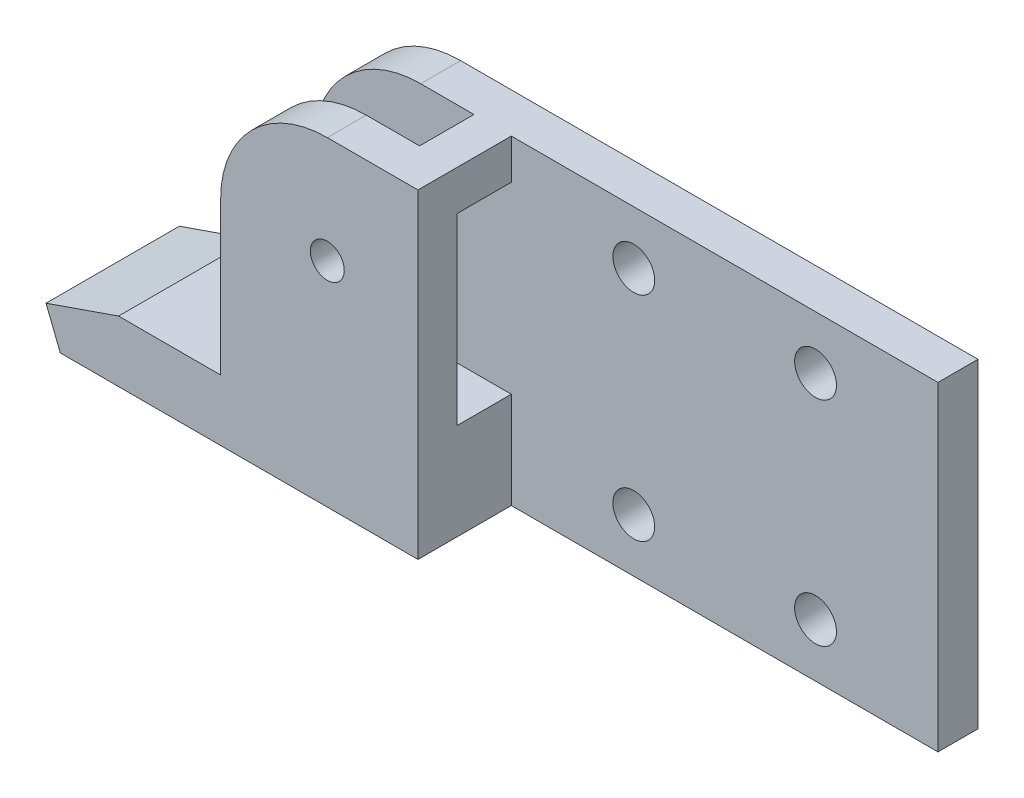
ISO-10303-21;
HEADER;
FILE_DESCRIPTION(('STEP AP214'),'2;1');
FILE_NAME('part.step','',(''),(''),'','','');
FILE_SCHEMA(('AUTOMOTIVE_DESIGN { 1 0 10303 214 1 1 1 1 }'));
ENDSEC;
DATA;
#1=APPLICATION_CONTEXT('core data for automotive mechanical design processes');
#2=APPLICATION_PROTOCOL_DEFINITION('international standard','automotive_design',2000,#1);
#3=PRODUCT_CONTEXT('',#1,'mechanical');
#4=PRODUCT('Part','Part','',(#3));
#5=PRODUCT_RELATED_PRODUCT_CATEGORY('part','',(#4));
#6=PRODUCT_DEFINITION_FORMATION('','',#4);
#7=PRODUCT_DEFINITION_CONTEXT('part definition',#1,'design');
#8=PRODUCT_DEFINITION('design','',#6,#7);
#9=PRODUCT_DEFINITION_SHAPE('','',#8);
#10=(LENGTH_UNIT() NAMED_UNIT(*) SI_UNIT(.MILLI.,.METRE.));
#11=(NAMED_UNIT(*) PLANE_ANGLE_UNIT() SI_UNIT($,.RADIAN.));
#12=(NAMED_UNIT(*) SI_UNIT($,.STERADIAN.) SOLID_ANGLE_UNIT());
#13=UNCERTAINTY_MEASURE_WITH_UNIT(LENGTH_MEASURE(1.E-05),#10,'distance_accuracy_value','');
#14=(GEOMETRIC_REPRESENTATION_CONTEXT(3) GLOBAL_UNCERTAINTY_ASSIGNED_CONTEXT((#13)) GLOBAL_UNIT_ASSIGNED_CONTEXT((#10,
#11,#12)) REPRESENTATION_CONTEXT('',''));
#15=CARTESIAN_POINT('',(0.,0.,0.));
#16=DIRECTION('',(0.,0.,1.));
#17=DIRECTION('',(1.,0.,0.));
#18=AXIS2_PLACEMENT_3D('',#15,#16,#17);
#19=CARTESIAN_POINT('',(-36.195000000001,-203.1333598559,4.7625));
#20=DIRECTION('',(0.,0.,-1.));
#21=DIRECTION('',(-1.,0.,0.));
#22=AXIS2_PLACEMENT_3D('',#19,#20,#21);
#23=CYLINDRICAL_SURFACE('',#22,12.7);
#24=DIRECTION('',(0.,0.,-1.));
#25=VECTOR('',#24,1.);
#26=CARTESIAN_POINT('',(-36.195000000001,-190.4333598559,4.7625));
#27=LINE('',#26,#25);
#28=CARTESIAN_POINT('',(-36.195000000001,-190.4333598559,15.875));
#29=VERTEX_POINT('',#28);
#30=CARTESIAN_POINT('',(-36.195000000001,-190.4333598559,11.2395));
#31=VERTEX_POINT('',#30);
#32=EDGE_CURVE('E276',#29,#31,#27,.T.);
#33=ORIENTED_EDGE('',*,*,#32,.T.);
#34=CARTESIAN_POINT('',(-36.195000000001,-203.1333598559,11.2395));
#35=DIRECTION('',(0.,0.,-1.));
#36=DIRECTION('',(0.,1.,0.));
#37=AXIS2_PLACEMENT_3D('',#34,#35,#36);
#38=CIRCLE('',#37,12.7);
#39=CARTESIAN_POINT('',(-48.895000000001,-203.1333598559,11.2395));
#40=VERTEX_POINT('',#39);
#41=EDGE_CURVE('E202',#40,#31,#38,.T.);
#42=ORIENTED_EDGE('',*,*,#41,.F.);
#43=DIRECTION('',(0.,0.,-1.));
#44=VECTOR('',#43,1.);
#45=CARTESIAN_POINT('',(-48.895000000001,-203.1333598559,4.7625));
#46=LINE('',#45,#44);
#47=CARTESIAN_POINT('',(-48.895000000001,-203.1333598559,15.875));
#48=VERTEX_POINT('',#47);
#49=EDGE_CURVE('E273',#48,#40,#46,.T.);
#50=ORIENTED_EDGE('',*,*,#49,.F.);
#51=CARTESIAN_POINT('',(-36.195000000001,-203.1333598559,15.875));
#52=DIRECTION('',(0.,0.,-1.));
#53=DIRECTION('',(-1.,0.,0.));
#54=AXIS2_PLACEMENT_3D('',#51,#52,#53);
#55=CIRCLE('',#54,12.7);
#56=EDGE_CURVE('E227',#48,#29,#55,.T.);
#57=ORIENTED_EDGE('',*,*,#56,.T.);
#58=EDGE_LOOP('',(#33,#42,#50,#57));
#59=FACE_BOUND('',#58,.T.);
#60=ADVANCED_FACE('F38',(#59),#23,.T.);
#61=CARTESIAN_POINT('',(-36.195000000001,-203.1333598559,4.7625));
#62=DIRECTION('',(0.,0.,1.));
#63=DIRECTION('',(1.,0.,0.));
#64=AXIS2_PLACEMENT_3D('',#61,#62,#63);
#65=CIRCLE('',#64,12.7);
#66=CARTESIAN_POINT('',(-36.195000000001,-190.4333598559,4.7625));
#67=VERTEX_POINT('',#66);
#68=CARTESIAN_POINT('',(-48.895000000001,-203.1333598559,4.7625));
#69=VERTEX_POINT('',#68);
#70=EDGE_CURVE('E61',#67,#69,#65,.T.);
#71=ORIENTED_EDGE('',*,*,#70,.F.);
#72=CARTESIAN_POINT('',(-36.195000000001,-190.4333598559,0.));
#73=VERTEX_POINT('',#72);
#74=EDGE_CURVE('E178',#67,#73,#27,.T.);
#75=ORIENTED_EDGE('',*,*,#74,.T.);
#76=CARTESIAN_POINT('',(-36.195000000001,-203.1333598559,0.));
#77=DIRECTION('',(0.,0.,1.));
#78=DIRECTION('',(1.,0.,0.));
#79=AXIS2_PLACEMENT_3D('',#76,#77,#78);
#80=CIRCLE('',#79,12.7);
#81=CARTESIAN_POINT('',(-48.895000000001,-203.1333598559,0.));
#82=VERTEX_POINT('',#81);
#83=EDGE_CURVE('E261',#73,#82,#80,.T.);
#84=ORIENTED_EDGE('',*,*,#83,.T.);
#85=EDGE_CURVE('E272',#69,#82,#46,.T.);
#86=ORIENTED_EDGE('',*,*,#85,.F.);
#87=EDGE_LOOP('',(#71,#75,#84,#86));
#88=FACE_BOUND('',#87,.T.);
#89=ADVANCED_FACE('F336',(#88),#23,.T.);
#90=CARTESIAN_POINT('',(-36.195000000001,-190.4333598559,4.7625));
#91=DIRECTION('',(0.,-1.,0.));
#92=DIRECTION('',(0.,0.,-1.));
#93=AXIS2_PLACEMENT_3D('',#90,#91,#92);
#94=PLANE('',#93);
#95=DIRECTION('',(-1.,0.,0.));
#96=VECTOR('',#95,1.);
#97=CARTESIAN_POINT('',(-29.845000000001,-190.4333598559,11.2395));
#98=LINE('',#97,#96);
#99=CARTESIAN_POINT('',(-29.845000000001,-190.4333598559,11.2395));
#100=VERTEX_POINT('',#99);
#101=EDGE_CURVE('E179',#100,#31,#98,.T.);
#102=ORIENTED_EDGE('',*,*,#101,.T.);
#103=ORIENTED_EDGE('',*,*,#32,.F.);
#104=DIRECTION('',(1.,0.,0.));
#105=VECTOR('',#104,1.);
#106=CARTESIAN_POINT('',(-36.195000000001,-190.4333598559,15.875));
#107=LINE('',#106,#105);
#108=CARTESIAN_POINT('',(-25.4000000000009,-190.4333598559,15.875));
#109=VERTEX_POINT('',#108);
#110=EDGE_CURVE('E205',#29,#109,#107,.T.);
#111=ORIENTED_EDGE('',*,*,#110,.T.);
#112=DIRECTION('',(0.,0.,-1.));
#113=VECTOR('',#112,1.);
#114=CARTESIAN_POINT('',(-25.4000000000009,-190.4333598559,15.875));
#115=LINE('',#114,#113);
#116=CARTESIAN_POINT('',(-25.4000000000009,-190.4333598559,4.7625));
#117=VERTEX_POINT('',#116);
#118=EDGE_CURVE('E230',#109,#117,#115,.T.);
#119=ORIENTED_EDGE('',*,*,#118,.T.);
#120=DIRECTION('',(-1.,0.,0.));
#121=VECTOR('',#120,1.);
#122=CARTESIAN_POINT('',(-36.195000000001,-190.4333598559,4.7625));
#123=LINE('',#122,#121);
#124=CARTESIAN_POINT('',(25.3999999999991,-190.4333598559,4.7625));
#125=VERTEX_POINT('',#124);
#126=EDGE_CURVE('E247',#125,#117,#123,.T.);
#127=ORIENTED_EDGE('',*,*,#126,.F.);
#128=DIRECTION('',(0.,0.,-1.));
#129=VECTOR('',#128,1.);
#130=CARTESIAN_POINT('',(25.3999999999991,-190.4333598559,4.7625));
#131=LINE('',#130,#129);
#132=CARTESIAN_POINT('',(25.3999999999991,-190.4333598559,0.));
#133=VERTEX_POINT('',#132);
#134=EDGE_CURVE('E279',#125,#133,#131,.T.);
#135=ORIENTED_EDGE('',*,*,#134,.T.);
#136=DIRECTION('',(-1.,0.,0.));
#137=VECTOR('',#136,1.);
#138=CARTESIAN_POINT('',(-36.195000000001,-190.4333598559,0.));
#139=LINE('',#138,#137);
#140=EDGE_CURVE('E259',#133,#73,#139,.T.);
#141=ORIENTED_EDGE('',*,*,#140,.T.);
#142=ORIENTED_EDGE('',*,*,#74,.F.);
#143=DIRECTION('',(-1.,0.,0.));
#144=VECTOR('',#143,1.);
#145=CARTESIAN_POINT('',(-29.845000000001,-190.4333598559,4.7625));
#146=LINE('',#145,#144);
#147=CARTESIAN_POINT('',(-29.845000000001,-190.4333598559,4.7625));
#148=VERTEX_POINT('',#147);
#149=EDGE_CURVE('E161',#148,#67,#146,.T.);
#150=ORIENTED_EDGE('',*,*,#149,.F.);
#151=DIRECTION('',(0.,0.,1.));
#152=VECTOR('',#151,1.);
#153=CARTESIAN_POINT('',(-29.845000000001,-190.4333598559,0.));
#154=LINE('',#153,#152);
#155=EDGE_CURVE('E166',#148,#100,#154,.T.);
#156=ORIENTED_EDGE('',*,*,#155,.T.);
#157=EDGE_LOOP('',(#102,#103,#111,#119,#127,#135,#141,#142,#150,#156));
#158=FACE_BOUND('',#157,.T.);
#159=ADVANCED_FACE('F176',(#158),#94,.F.);
#160=CARTESIAN_POINT('',(-24.765000000001,-195.1958598559,0.));
#161=DIRECTION('',(0.,-1.,0.));
#162=DIRECTION('',(1.,0.,0.));
#163=AXIS2_PLACEMENT_3D('',#160,#161,#162);
#164=PLANE('',#163);
#165=DIRECTION('',(-1.,0.,0.));
#166=VECTOR('',#165,1.);
#167=CARTESIAN_POINT('',(-24.765000000001,-195.1958598559,11.2395));
#168=LINE('',#167,#166);
#169=CARTESIAN_POINT('',(-25.4000000000009,-195.1958598559,11.2395));
#170=VERTEX_POINT('',#169);
#171=CARTESIAN_POINT('',(-29.845000000001,-195.1958598559,11.2395));
#172=VERTEX_POINT('',#171);
#173=EDGE_CURVE('E192',#170,#172,#168,.T.);
#174=ORIENTED_EDGE('',*,*,#173,.T.);
#175=DIRECTION('',(0.,0.,1.));
#176=VECTOR('',#175,1.);
#177=CARTESIAN_POINT('',(-29.845000000001,-195.1958598559,0.));
#178=LINE('',#177,#176);
#179=CARTESIAN_POINT('',(-29.845000000001,-195.1958598559,4.7625));
#180=VERTEX_POINT('',#179);
#181=EDGE_CURVE('E165',#180,#172,#178,.T.);
#182=ORIENTED_EDGE('',*,*,#181,.F.);
#183=DIRECTION('',(-1.,0.,0.));
#184=VECTOR('',#183,1.);
#185=CARTESIAN_POINT('',(-24.765000000001,-195.1958598559,4.7625));
#186=LINE('',#185,#184);
#187=CARTESIAN_POINT('',(-25.4000000000009,-195.1958598559,4.7625));
#188=VERTEX_POINT('',#187);
#189=EDGE_CURVE('E164',#188,#180,#186,.T.);
#190=ORIENTED_EDGE('',*,*,#189,.F.);
#191=DIRECTION('',(0.,0.,-1.));
#192=VECTOR('',#191,1.);
#193=CARTESIAN_POINT('',(-25.4000000000009,-195.1958598559,15.875));
#194=LINE('',#193,#192);
#195=EDGE_CURVE('E291',#170,#188,#194,.T.);
#196=ORIENTED_EDGE('',*,*,#195,.F.);
#197=EDGE_LOOP('',(#174,#182,#190,#196));
#198=FACE_BOUND('',#197,.T.);
#199=ADVANCED_FACE('F362',(#198),#164,.T.);
#200=CARTESIAN_POINT('',(-48.895000000001,-221.260552334303,4.7625));
#201=DIRECTION('',(1.,0.,0.));
#202=DIRECTION('',(0.,1.,0.));
#203=AXIS2_PLACEMENT_3D('',#200,#201,#202);
#204=PLANE('',#203);
#205=DIRECTION('',(0.,-1.,0.));
#206=VECTOR('',#205,1.);
#207=CARTESIAN_POINT('',(-48.895000000001,0.,11.2395));
#208=LINE('',#207,#206);
#209=CARTESIAN_POINT('',(-48.895000000001,-217.052510473162,11.2395));
#210=VERTEX_POINT('',#209);
#211=EDGE_CURVE('E181',#40,#210,#208,.T.);
#212=ORIENTED_EDGE('',*,*,#211,.T.);
#213=DIRECTION('',(0.,0.,-1.));
#214=VECTOR('',#213,1.);
#215=CARTESIAN_POINT('',(-48.895000000001,-217.052510473162,0.));
#216=LINE('',#215,#214);
#217=CARTESIAN_POINT('',(-48.895000000001,-217.052510473162,4.7625));
#218=VERTEX_POINT('',#217);
#219=EDGE_CURVE('E189',#210,#218,#216,.T.);
#220=ORIENTED_EDGE('',*,*,#219,.T.);
#221=DIRECTION('',(0.,1.,0.));
#222=VECTOR('',#221,1.);
#223=CARTESIAN_POINT('',(-48.895000000001,0.,4.7625));
#224=LINE('',#223,#222);
#225=EDGE_CURVE('E187',#218,#69,#224,.T.);
#226=ORIENTED_EDGE('',*,*,#225,.T.);
#227=ORIENTED_EDGE('',*,*,#85,.T.);
#228=DIRECTION('',(0.,-1.,0.));
#229=VECTOR('',#228,1.);
#230=CARTESIAN_POINT('',(-48.895000000001,-221.260552334303,0.));
#231=LINE('',#230,#229);
#232=CARTESIAN_POINT('',(-48.895000000001,-221.260552334303,0.));
#233=VERTEX_POINT('',#232);
#234=EDGE_CURVE('E264',#82,#233,#231,.T.);
#235=ORIENTED_EDGE('',*,*,#234,.T.);
#236=DIRECTION('',(0.,0.,-1.));
#237=VECTOR('',#236,1.);
#238=CARTESIAN_POINT('',(-48.895000000001,-221.260552334303,4.7625));
#239=LINE('',#238,#237);
#240=CARTESIAN_POINT('',(-48.895000000001,-221.260552334303,15.875));
#241=VERTEX_POINT('',#240);
#242=EDGE_CURVE('E269',#241,#233,#239,.T.);
#243=ORIENTED_EDGE('',*,*,#242,.F.);
#244=DIRECTION('',(0.,1.,0.));
#245=VECTOR('',#244,1.);
#246=CARTESIAN_POINT('',(-48.895000000001,-221.260552334303,15.875));
#247=LINE('',#246,#245);
#248=EDGE_CURVE('E224',#241,#48,#247,.T.);
#249=ORIENTED_EDGE('',*,*,#248,.T.);
#250=ORIENTED_EDGE('',*,*,#49,.T.);
#251=EDGE_LOOP('',(#212,#220,#226,#227,#235,#243,#249,#250));
#252=FACE_BOUND('',#251,.T.);
#253=ADVANCED_FACE('F306',(#252),#204,.F.);
#254=CARTESIAN_POINT('',(-25.4000000000009,-190.4333598559,15.875));
#255=DIRECTION('',(1.,0.,0.));
#256=DIRECTION('',(0.,0.,-1.));
#257=AXIS2_PLACEMENT_3D('',#254,#255,#256);
#258=PLANE('',#257);
#259=DIRECTION('',(0.,-1.,0.));
#260=VECTOR('',#259,1.);
#261=CARTESIAN_POINT('',(-25.4000000000009,-190.4333598559,4.7625));
#262=LINE('',#261,#260);
#263=CARTESIAN_POINT('',(-25.4000000000009,-217.052510473162,4.7625));
#264=VERTEX_POINT('',#263);
#265=CARTESIAN_POINT('',(-25.4000000000009,-228.533359855901,4.7625));
#266=VERTEX_POINT('',#265);
#267=EDGE_CURVE('E204',#264,#266,#262,.T.);
#268=ORIENTED_EDGE('',*,*,#267,.F.);
#269=DIRECTION('',(0.,0.,1.));
#270=VECTOR('',#269,1.);
#271=CARTESIAN_POINT('',(-25.4000000000009,-217.052510473162,15.875));
#272=LINE('',#271,#270);
#273=CARTESIAN_POINT('',(-25.4000000000009,-217.052510473162,11.2395));
#274=VERTEX_POINT('',#273);
#275=EDGE_CURVE('E11',#264,#274,#272,.T.);
#276=ORIENTED_EDGE('',*,*,#275,.T.);
#277=DIRECTION('',(0.,1.,0.));
#278=VECTOR('',#277,1.);
#279=CARTESIAN_POINT('',(-25.4000000000009,-190.4333598559,11.2395));
#280=LINE('',#279,#278);
#281=EDGE_CURVE('E46',#274,#170,#280,.T.);
#282=ORIENTED_EDGE('',*,*,#281,.T.);
#283=ORIENTED_EDGE('',*,*,#195,.T.);
#284=EDGE_CURVE('E209',#117,#188,#262,.T.);
#285=ORIENTED_EDGE('',*,*,#284,.F.);
#286=ORIENTED_EDGE('',*,*,#118,.F.);
#287=DIRECTION('',(0.,-1.,0.));
#288=VECTOR('',#287,1.);
#289=CARTESIAN_POINT('',(-25.4000000000009,-190.4333598559,15.875));
#290=LINE('',#289,#288);
#291=CARTESIAN_POINT('',(-25.4000000000009,-228.533359855901,15.875));
#292=VERTEX_POINT('',#291);
#293=EDGE_CURVE('E208',#109,#292,#290,.T.);
#294=ORIENTED_EDGE('',*,*,#293,.T.);
#295=DIRECTION('',(0.,0.,-1.));
#296=VECTOR('',#295,1.);
#297=CARTESIAN_POINT('',(-25.4000000000009,-228.533359855901,15.875));
#298=LINE('',#297,#296);
#299=EDGE_CURVE('E232',#292,#266,#298,.T.);
#300=ORIENTED_EDGE('',*,*,#299,.T.);
#301=EDGE_LOOP('',(#268,#276,#282,#283,#285,#286,#294,#300));
#302=FACE_BOUND('',#301,.T.);
#303=ADVANCED_FACE('F296',(#302),#258,.T.);
#304=CARTESIAN_POINT('',(-36.195000000001,-203.1333598559,4.7625));
#305=DIRECTION('',(0.,0.,1.));
#306=DIRECTION('',(1.,0.,0.));
#307=AXIS2_PLACEMENT_3D('',#304,#305,#306);
#308=PLANE('',#307);
#309=CARTESIAN_POINT('',(-10.8204,-196.7833598559,4.7625));
#310=DIRECTION('',(0.,0.,1.));
#311=DIRECTION('',(1.,0.,0.));
#312=AXIS2_PLACEMENT_3D('',#309,#310,#311);
#313=CIRCLE('',#312,2.4892);
#314=CARTESIAN_POINT('',(-8.3312,-196.7833598559,4.7625));
#315=VERTEX_POINT('',#314);
#316=EDGE_CURVE('E630',#315,#315,#313,.T.);
#317=ORIENTED_EDGE('',*,*,#316,.F.);
#318=EDGE_LOOP('',(#317));
#319=FACE_BOUND('',#318,.T.);
#320=CARTESIAN_POINT('',(-10.8204,-222.1833598559,4.7625));
#321=DIRECTION('',(0.,0.,1.));
#322=DIRECTION('',(1.,0.,0.));
#323=AXIS2_PLACEMENT_3D('',#320,#321,#322);
#324=CIRCLE('',#323,2.4892);
#325=CARTESIAN_POINT('',(-8.3312,-222.1833598559,4.7625));
#326=VERTEX_POINT('',#325);
#327=EDGE_CURVE('E632',#326,#326,#324,.T.);
#328=ORIENTED_EDGE('',*,*,#327,.F.);
#329=EDGE_LOOP('',(#328));
#330=FACE_BOUND('',#329,.T.);
#331=CARTESIAN_POINT('',(10.8204,-222.1833598559,4.7625));
#332=DIRECTION('',(0.,0.,1.));
#333=DIRECTION('',(1.,0.,0.));
#334=AXIS2_PLACEMENT_3D('',#331,#332,#333);
#335=CIRCLE('',#334,2.4892);
#336=CARTESIAN_POINT('',(13.3096,-222.1833598559,4.7625));
#337=VERTEX_POINT('',#336);
#338=EDGE_CURVE('E640',#337,#337,#335,.T.);
#339=ORIENTED_EDGE('',*,*,#338,.F.);
#340=EDGE_LOOP('',(#339));
#341=FACE_BOUND('',#340,.T.);
#342=CARTESIAN_POINT('',(10.8204,-196.7833598559,4.7625));
#343=DIRECTION('',(0.,0.,1.));
#344=DIRECTION('',(1.,0.,0.));
#345=AXIS2_PLACEMENT_3D('',#342,#343,#344);
#346=CIRCLE('',#345,2.4892);
#347=CARTESIAN_POINT('',(13.3096,-196.7833598559,4.7625));
#348=VERTEX_POINT('',#347);
#349=EDGE_CURVE('E646',#348,#348,#346,.T.);
#350=ORIENTED_EDGE('',*,*,#349,.F.);
#351=EDGE_LOOP('',(#350));
#352=FACE_BOUND('',#351,.T.);
#353=DIRECTION('',(-1.,0.,0.));
#354=VECTOR('',#353,1.);
#355=CARTESIAN_POINT('',(-24.765000000001,-217.052510473162,4.7625));
#356=LINE('',#355,#354);
#357=EDGE_CURVE('E195',#264,#218,#356,.T.);
#358=ORIENTED_EDGE('',*,*,#357,.F.);
#359=ORIENTED_EDGE('',*,*,#267,.T.);
#360=DIRECTION('',(1.,0.,0.));
#361=VECTOR('',#360,1.);
#362=CARTESIAN_POINT('',(25.3999999999991,-228.533359855901,4.7625));
#363=LINE('',#362,#361);
#364=CARTESIAN_POINT('',(25.3999999999991,-228.533359855901,4.7625));
#365=VERTEX_POINT('',#364);
#366=EDGE_CURVE('E242',#266,#365,#363,.T.);
#367=ORIENTED_EDGE('',*,*,#366,.T.);
#368=DIRECTION('',(0.,1.,0.));
#369=VECTOR('',#368,1.);
#370=CARTESIAN_POINT('',(25.3999999999991,-190.4333598559,4.7625));
#371=LINE('',#370,#369);
#372=EDGE_CURVE('E244',#365,#125,#371,.T.);
#373=ORIENTED_EDGE('',*,*,#372,.T.);
#374=ORIENTED_EDGE('',*,*,#126,.T.);
#375=ORIENTED_EDGE('',*,*,#284,.T.);
#376=ORIENTED_EDGE('',*,*,#189,.T.);
#377=DIRECTION('',(0.,1.,0.));
#378=VECTOR('',#377,1.);
#379=CARTESIAN_POINT('',(-29.845000000001,0.,4.7625));
#380=LINE('',#379,#378);
#381=EDGE_CURVE('E53',#180,#148,#380,.T.);
#382=ORIENTED_EDGE('',*,*,#381,.T.);
#383=ORIENTED_EDGE('',*,*,#149,.T.);
#384=ORIENTED_EDGE('',*,*,#70,.T.);
#385=ORIENTED_EDGE('',*,*,#225,.F.);
#386=EDGE_LOOP('',(#358,#359,#367,#373,#374,#375,#376,#382,#383,#384,#385));
#387=FACE_BOUND('',#386,.T.);
#388=CARTESIAN_POINT('',(-36.195000000001,-203.1333598559,4.7625));
#389=DIRECTION('',(0.,0.,1.));
#390=DIRECTION('',(1.,0.,0.));
#391=AXIS2_PLACEMENT_3D('',#388,#389,#390);
#392=CIRCLE('',#391,3.175);
#393=CARTESIAN_POINT('',(-39.370000000001,-203.1333598559,4.7625));
#394=VERTEX_POINT('',#393);
#395=EDGE_CURVE('E201',#394,#394,#392,.T.);
#396=ORIENTED_EDGE('',*,*,#395,.F.);
#397=EDGE_LOOP('',(#396));
#398=FACE_BOUND('',#397,.T.);
#399=ADVANCED_FACE('F158',(#319,#330,#341,#352,#387,#398),#308,.T.);
#400=CARTESIAN_POINT('',(-36.195000000001,-203.1333598559,0.));
#401=DIRECTION('',(0.,0.,1.));
#402=DIRECTION('',(1.,0.,0.));
#403=AXIS2_PLACEMENT_3D('',#400,#401,#402);
#404=PLANE('',#403);
#405=CARTESIAN_POINT('',(-10.8204,-196.7833598559,0.));
#406=DIRECTION('',(0.,0.,1.));
#407=DIRECTION('',(1.,0.,0.));
#408=AXIS2_PLACEMENT_3D('',#405,#406,#407);
#409=CIRCLE('',#408,2.4892);
#410=CARTESIAN_POINT('',(-8.3312,-196.7833598559,0.));
#411=VERTEX_POINT('',#410);
#412=EDGE_CURVE('E627',#411,#411,#409,.T.);
#413=ORIENTED_EDGE('',*,*,#412,.T.);
#414=EDGE_LOOP('',(#413));
#415=FACE_BOUND('',#414,.T.);
#416=CARTESIAN_POINT('',(-10.8204,-222.1833598559,0.));
#417=DIRECTION('',(0.,0.,1.));
#418=DIRECTION('',(1.,0.,0.));
#419=AXIS2_PLACEMENT_3D('',#416,#417,#418);
#420=CIRCLE('',#419,2.4892);
#421=CARTESIAN_POINT('',(-8.3312,-222.1833598559,0.));
#422=VERTEX_POINT('',#421);
#423=EDGE_CURVE('E637',#422,#422,#420,.T.);
#424=ORIENTED_EDGE('',*,*,#423,.T.);
#425=EDGE_LOOP('',(#424));
#426=FACE_BOUND('',#425,.T.);
#427=CARTESIAN_POINT('',(10.8204,-222.1833598559,0.));
#428=DIRECTION('',(0.,0.,1.));
#429=DIRECTION('',(1.,0.,0.));
#430=AXIS2_PLACEMENT_3D('',#427,#428,#429);
#431=CIRCLE('',#430,2.4892);
#432=CARTESIAN_POINT('',(13.3096,-222.1833598559,0.));
#433=VERTEX_POINT('',#432);
#434=EDGE_CURVE('E643',#433,#433,#431,.T.);
#435=ORIENTED_EDGE('',*,*,#434,.T.);
#436=EDGE_LOOP('',(#435));
#437=FACE_BOUND('',#436,.T.);
#438=CARTESIAN_POINT('',(10.8204,-196.7833598559,0.));
#439=DIRECTION('',(0.,0.,1.));
#440=DIRECTION('',(1.,0.,0.));
#441=AXIS2_PLACEMENT_3D('',#438,#439,#440);
#442=CIRCLE('',#441,2.4892);
#443=CARTESIAN_POINT('',(13.3096,-196.7833598559,0.));
#444=VERTEX_POINT('',#443);
#445=EDGE_CURVE('E649',#444,#444,#442,.T.);
#446=ORIENTED_EDGE('',*,*,#445,.T.);
#447=EDGE_LOOP('',(#446));
#448=FACE_BOUND('',#447,.T.);
#449=DIRECTION('',(-0.944948295670195,-0.327219679282884,0.));
#450=VECTOR('',#449,1.);
#451=CARTESIAN_POINT('',(-69.6868563657894,-224.252380141043,0.));
#452=LINE('',#451,#450);
#453=CARTESIAN_POINT('',(-61.0470257996289,-221.260552334303,0.));
#454=VERTEX_POINT('',#453);
#455=CARTESIAN_POINT('',(-69.6868563657894,-224.252380141043,0.));
#456=VERTEX_POINT('',#455);
#457=EDGE_CURVE('E241',#454,#456,#452,.T.);
#458=ORIENTED_EDGE('',*,*,#457,.F.);
#459=DIRECTION('',(-1.,0.,0.));
#460=VECTOR('',#459,1.);
#461=CARTESIAN_POINT('',(-61.0470257996289,-221.260552334303,0.));
#462=LINE('',#461,#460);
#463=EDGE_CURVE('E245',#233,#454,#462,.T.);
#464=ORIENTED_EDGE('',*,*,#463,.F.);
#465=ORIENTED_EDGE('',*,*,#234,.F.);
#466=ORIENTED_EDGE('',*,*,#83,.F.);
#467=ORIENTED_EDGE('',*,*,#140,.F.);
#468=DIRECTION('',(0.,1.,0.));
#469=VECTOR('',#468,1.);
#470=CARTESIAN_POINT('',(25.3999999999991,-190.4333598559,0.));
#471=LINE('',#470,#469);
#472=CARTESIAN_POINT('',(25.3999999999991,-228.533359855901,0.));
#473=VERTEX_POINT('',#472);
#474=EDGE_CURVE('E257',#473,#133,#471,.T.);
#475=ORIENTED_EDGE('',*,*,#474,.F.);
#476=DIRECTION('',(1.,0.,0.));
#477=VECTOR('',#476,1.);
#478=CARTESIAN_POINT('',(25.3999999999991,-228.533359855901,0.));
#479=LINE('',#478,#477);
#480=CARTESIAN_POINT('',(-67.9861863425909,-228.533359855901,0.));
#481=VERTEX_POINT('',#480);
#482=EDGE_CURVE('E255',#481,#473,#479,.T.);
#483=ORIENTED_EDGE('',*,*,#482,.F.);
#484=DIRECTION('',(0.369195948458416,-0.929351575907573,0.));
#485=VECTOR('',#484,1.);
#486=CARTESIAN_POINT('',(-67.9861863425909,-228.533359855901,0.));
#487=LINE('',#486,#485);
#488=EDGE_CURVE('E253',#456,#481,#487,.T.);
#489=ORIENTED_EDGE('',*,*,#488,.F.);
#490=EDGE_LOOP('',(#458,#464,#465,#466,#467,#475,#483,#489));
#491=FACE_BOUND('',#490,.T.);
#492=CARTESIAN_POINT('',(-36.195000000001,-203.1333598559,0.));
#493=DIRECTION('',(0.,0.,1.));
#494=DIRECTION('',(1.,0.,0.));
#495=AXIS2_PLACEMENT_3D('',#492,#493,#494);
#496=CIRCLE('',#495,3.175);
#497=CARTESIAN_POINT('',(-39.370000000001,-203.1333598559,0.));
#498=VERTEX_POINT('',#497);
#499=EDGE_CURVE('E235',#498,#498,#496,.T.);
#500=ORIENTED_EDGE('',*,*,#499,.T.);
#501=EDGE_LOOP('',(#500));
#502=FACE_BOUND('',#501,.T.);
#503=ADVANCED_FACE('F329',(#415,#426,#437,#448,#491,#502),#404,.F.);
#504=CARTESIAN_POINT('',(-69.6868563657894,-224.252380141043,4.7625));
#505=DIRECTION('',(0.327219679282884,-0.944948295670195,0.));
#506=DIRECTION('',(0.944948295670195,0.327219679282884,0.));
#507=AXIS2_PLACEMENT_3D('',#504,#505,#506);
#508=PLANE('',#507);
#509=ORIENTED_EDGE('',*,*,#457,.T.);
#510=DIRECTION('',(0.,0.,-1.));
#511=VECTOR('',#510,1.);
#512=CARTESIAN_POINT('',(-69.6868563657894,-224.252380141043,4.7625));
#513=LINE('',#512,#511);
#514=CARTESIAN_POINT('',(-69.6868563657894,-224.252380141043,15.875));
#515=VERTEX_POINT('',#514);
#516=EDGE_CURVE('E288',#515,#456,#513,.T.);
#517=ORIENTED_EDGE('',*,*,#516,.F.);
#518=DIRECTION('',(0.944948295670195,0.327219679282884,0.));
#519=VECTOR('',#518,1.);
#520=CARTESIAN_POINT('',(-69.6868563657894,-224.252380141043,15.875));
#521=LINE('',#520,#519);
#522=CARTESIAN_POINT('',(-61.0470257996289,-221.260552334303,15.875));
#523=VERTEX_POINT('',#522);
#524=EDGE_CURVE('E218',#515,#523,#521,.T.);
#525=ORIENTED_EDGE('',*,*,#524,.T.);
#526=DIRECTION('',(0.,0.,-1.));
#527=VECTOR('',#526,1.);
#528=CARTESIAN_POINT('',(-61.0470257996289,-221.260552334303,4.7625));
#529=LINE('',#528,#527);
#530=EDGE_CURVE('E250',#523,#454,#529,.T.);
#531=ORIENTED_EDGE('',*,*,#530,.T.);
#532=EDGE_LOOP('',(#509,#517,#525,#531));
#533=FACE_BOUND('',#532,.T.);
#534=ADVANCED_FACE('F40',(#533),#508,.F.);
#535=CARTESIAN_POINT('',(-67.9861863425909,-228.533359855901,4.7625));
#536=DIRECTION('',(0.929351575907574,0.369195948458417,0.));
#537=DIRECTION('',(-0.369195948458417,0.929351575907574,0.));
#538=AXIS2_PLACEMENT_3D('',#535,#536,#537);
#539=PLANE('',#538);
#540=ORIENTED_EDGE('',*,*,#488,.T.);
#541=DIRECTION('',(0.,0.,-1.));
#542=VECTOR('',#541,1.);
#543=CARTESIAN_POINT('',(-67.9861863425909,-228.533359855901,4.7625));
#544=LINE('',#543,#542);
#545=CARTESIAN_POINT('',(-67.9861863425909,-228.533359855901,15.875));
#546=VERTEX_POINT('',#545);
#547=EDGE_CURVE('E285',#546,#481,#544,.T.);
#548=ORIENTED_EDGE('',*,*,#547,.F.);
#549=DIRECTION('',(-0.369195948458416,0.929351575907573,0.));
#550=VECTOR('',#549,1.);
#551=CARTESIAN_POINT('',(-67.9861863425909,-228.533359855901,15.875));
#552=LINE('',#551,#550);
#553=EDGE_CURVE('E215',#546,#515,#552,.T.);
#554=ORIENTED_EDGE('',*,*,#553,.T.);
#555=ORIENTED_EDGE('',*,*,#516,.T.);
#556=EDGE_LOOP('',(#540,#548,#554,#555));
#557=FACE_BOUND('',#556,.T.);
#558=ADVANCED_FACE('F343',(#557),#539,.F.);
#559=CARTESIAN_POINT('',(25.3999999999991,-228.533359855901,4.7625));
#560=DIRECTION('',(0.,1.,0.));
#561=DIRECTION('',(0.,0.,1.));
#562=AXIS2_PLACEMENT_3D('',#559,#560,#561);
#563=PLANE('',#562);
#564=ORIENTED_EDGE('',*,*,#482,.T.);
#565=DIRECTION('',(0.,0.,-1.));
#566=VECTOR('',#565,1.);
#567=CARTESIAN_POINT('',(25.3999999999991,-228.533359855901,4.7625));
#568=LINE('',#567,#566);
#569=EDGE_CURVE('E282',#365,#473,#568,.T.);
#570=ORIENTED_EDGE('',*,*,#569,.F.);
#571=ORIENTED_EDGE('',*,*,#366,.F.);
#572=ORIENTED_EDGE('',*,*,#299,.F.);
#573=DIRECTION('',(-1.,0.,0.));
#574=VECTOR('',#573,1.);
#575=CARTESIAN_POINT('',(-25.4000000000009,-228.533359855901,15.875));
#576=LINE('',#575,#574);
#577=EDGE_CURVE('E212',#292,#546,#576,.T.);
#578=ORIENTED_EDGE('',*,*,#577,.T.);
#579=ORIENTED_EDGE('',*,*,#547,.T.);
#580=EDGE_LOOP('',(#564,#570,#571,#572,#578,#579));
#581=FACE_BOUND('',#580,.T.);
#582=ADVANCED_FACE('F345',(#581),#563,.F.);
#583=CARTESIAN_POINT('',(25.3999999999991,-190.4333598559,4.7625));
#584=DIRECTION('',(-1.,0.,0.));
#585=DIRECTION('',(0.,-1.,0.));
#586=AXIS2_PLACEMENT_3D('',#583,#584,#585);
#587=PLANE('',#586);
#588=ORIENTED_EDGE('',*,*,#474,.T.);
#589=ORIENTED_EDGE('',*,*,#134,.F.);
#590=ORIENTED_EDGE('',*,*,#372,.F.);
#591=ORIENTED_EDGE('',*,*,#569,.T.);
#592=EDGE_LOOP('',(#588,#589,#590,#591));
#593=FACE_BOUND('',#592,.T.);
#594=ADVANCED_FACE('F324',(#593),#587,.F.);
#595=CARTESIAN_POINT('',(-61.0470257996289,-221.260552334303,4.7625));
#596=DIRECTION('',(0.,-1.,0.));
#597=DIRECTION('',(0.,0.,-1.));
#598=AXIS2_PLACEMENT_3D('',#595,#596,#597);
#599=PLANE('',#598);
#600=ORIENTED_EDGE('',*,*,#463,.T.);
#601=ORIENTED_EDGE('',*,*,#530,.F.);
#602=DIRECTION('',(1.,0.,0.));
#603=VECTOR('',#602,1.);
#604=CARTESIAN_POINT('',(-61.0470257996289,-221.260552334303,15.875));
#605=LINE('',#604,#603);
#606=EDGE_CURVE('E221',#523,#241,#605,.T.);
#607=ORIENTED_EDGE('',*,*,#606,.T.);
#608=ORIENTED_EDGE('',*,*,#242,.T.);
#609=EDGE_LOOP('',(#600,#601,#607,#608));
#610=FACE_BOUND('',#609,.T.);
#611=ADVANCED_FACE('F338',(#610),#599,.F.);
#612=CARTESIAN_POINT('',(-36.195000000001,-203.1333598559,4.7625));
#613=DIRECTION('',(0.,0.,-1.));
#614=DIRECTION('',(-1.,0.,0.));
#615=AXIS2_PLACEMENT_3D('',#612,#613,#614);
#616=CYLINDRICAL_SURFACE('',#615,3.175);
#617=CARTESIAN_POINT('',(-39.370000000001,-203.1333598559,4.7625));
#618=CARTESIAN_POINT('',(-39.370000000001,-203.1333598559,4.712890625));
#619=CARTESIAN_POINT('',(-39.370000000001,-203.1333598559,4.66328125));
#620=CARTESIAN_POINT('',(-39.370000000001,-203.1333598559,4.5640625));
#621=CARTESIAN_POINT('',(-39.370000000001,-203.1333598559,4.514453125));
#622=CARTESIAN_POINT('',(-39.370000000001,-203.1333598559,4.415234375));
#623=CARTESIAN_POINT('',(-39.370000000001,-203.1333598559,4.365625));
#624=CARTESIAN_POINT('',(-39.370000000001,-203.1333598559,4.26640625));
#625=CARTESIAN_POINT('',(-39.370000000001,-203.1333598559,4.216796875));
#626=CARTESIAN_POINT('',(-39.370000000001,-203.1333598559,4.117578125));
#627=CARTESIAN_POINT('',(-39.370000000001,-203.1333598559,4.06796875));
#628=CARTESIAN_POINT('',(-39.370000000001,-203.1333598559,3.96875));
#629=CARTESIAN_POINT('',(-39.370000000001,-203.1333598559,3.919140625));
#630=CARTESIAN_POINT('',(-39.370000000001,-203.1333598559,3.819921875));
#631=CARTESIAN_POINT('',(-39.370000000001,-203.1333598559,3.7703125));
#632=CARTESIAN_POINT('',(-39.370000000001,-203.1333598559,3.67109375));
#633=CARTESIAN_POINT('',(-39.370000000001,-203.1333598559,3.621484375));
#634=CARTESIAN_POINT('',(-39.370000000001,-203.1333598559,3.522265625));
#635=CARTESIAN_POINT('',(-39.370000000001,-203.1333598559,3.47265625));
#636=CARTESIAN_POINT('',(-39.370000000001,-203.1333598559,3.3734375));
#637=CARTESIAN_POINT('',(-39.370000000001,-203.1333598559,3.323828125));
#638=CARTESIAN_POINT('',(-39.370000000001,-203.1333598559,3.224609375));
#639=CARTESIAN_POINT('',(-39.370000000001,-203.1333598559,3.175));
#640=CARTESIAN_POINT('',(-39.370000000001,-203.1333598559,3.07578125));
#641=CARTESIAN_POINT('',(-39.370000000001,-203.1333598559,3.026171875));
#642=CARTESIAN_POINT('',(-39.370000000001,-203.1333598559,2.926953125));
#643=CARTESIAN_POINT('',(-39.370000000001,-203.1333598559,2.87734375));
#644=CARTESIAN_POINT('',(-39.370000000001,-203.1333598559,2.778125));
#645=CARTESIAN_POINT('',(-39.370000000001,-203.1333598559,2.728515625));
#646=CARTESIAN_POINT('',(-39.370000000001,-203.1333598559,2.629296875));
#647=CARTESIAN_POINT('',(-39.370000000001,-203.1333598559,2.5796875));
#648=CARTESIAN_POINT('',(-39.370000000001,-203.1333598559,2.48046875));
#649=CARTESIAN_POINT('',(-39.370000000001,-203.1333598559,2.430859375));
#650=CARTESIAN_POINT('',(-39.370000000001,-203.1333598559,2.331640625));
#651=CARTESIAN_POINT('',(-39.370000000001,-203.1333598559,2.28203125));
#652=CARTESIAN_POINT('',(-39.370000000001,-203.1333598559,2.1828125));
#653=CARTESIAN_POINT('',(-39.370000000001,-203.1333598559,2.133203125));
#654=CARTESIAN_POINT('',(-39.370000000001,-203.1333598559,2.033984375));
#655=CARTESIAN_POINT('',(-39.370000000001,-203.1333598559,1.984375));
#656=CARTESIAN_POINT('',(-39.370000000001,-203.1333598559,1.88515625));
#657=CARTESIAN_POINT('',(-39.370000000001,-203.1333598559,1.835546875));
#658=CARTESIAN_POINT('',(-39.370000000001,-203.1333598559,1.736328125));
#659=CARTESIAN_POINT('',(-39.370000000001,-203.1333598559,1.68671875));
#660=CARTESIAN_POINT('',(-39.370000000001,-203.1333598559,1.5875));
#661=CARTESIAN_POINT('',(-39.370000000001,-203.1333598559,1.537890625));
#662=CARTESIAN_POINT('',(-39.370000000001,-203.1333598559,1.438671875));
#663=CARTESIAN_POINT('',(-39.370000000001,-203.1333598559,1.3890625));
#664=CARTESIAN_POINT('',(-39.370000000001,-203.1333598559,1.28984375));
#665=CARTESIAN_POINT('',(-39.370000000001,-203.1333598559,1.240234375));
#666=CARTESIAN_POINT('',(-39.370000000001,-203.1333598559,1.141015625));
#667=CARTESIAN_POINT('',(-39.370000000001,-203.1333598559,1.09140625));
#668=CARTESIAN_POINT('',(-39.370000000001,-203.1333598559,0.9921875));
#669=CARTESIAN_POINT('',(-39.370000000001,-203.1333598559,0.942578125));
#670=CARTESIAN_POINT('',(-39.370000000001,-203.1333598559,0.843359375));
#671=CARTESIAN_POINT('',(-39.370000000001,-203.1333598559,0.79375));
#672=CARTESIAN_POINT('',(-39.370000000001,-203.1333598559,0.69453125));
#673=CARTESIAN_POINT('',(-39.370000000001,-203.1333598559,0.644921875));
#674=CARTESIAN_POINT('',(-39.370000000001,-203.1333598559,0.545703125));
#675=CARTESIAN_POINT('',(-39.370000000001,-203.1333598559,0.49609375));
#676=CARTESIAN_POINT('',(-39.370000000001,-203.1333598559,0.396875));
#677=CARTESIAN_POINT('',(-39.370000000001,-203.1333598559,0.347265625));
#678=CARTESIAN_POINT('',(-39.370000000001,-203.1333598559,0.248046875));
#679=CARTESIAN_POINT('',(-39.370000000001,-203.1333598559,0.1984375));
#680=CARTESIAN_POINT('',(-39.370000000001,-203.1333598559,0.09921875));
#681=CARTESIAN_POINT('',(-39.370000000001,-203.1333598559,0.049609375));
#682=CARTESIAN_POINT('',(-39.370000000001,-203.1333598559,0.));
#683=B_SPLINE_CURVE_WITH_KNOTS('',3,(#617,#618,#619,#620,#621,#622,#623,#624,#625,#626,#627,
#628,#629,#630,#631,#632,#633,#634,#635,#636,#637,#638,#639,#640,#641,#642,#643,#644,#645,#646,
#647,#648,#649,#650,#651,#652,#653,#654,#655,#656,#657,#658,#659,#660,#661,#662,#663,#664,#665,
#666,#667,#668,#669,#670,#671,#672,#673,#674,#675,#676,#677,#678,#679,#680,#681,#682),
.UNSPECIFIED.,.F.,.F.,(4,2,2,2,2,2,2,2,2,2,2,2,2,2,2,2,2,2,2,2,2,2,2,2,2,2,2,2,2,2,2,2,4),(0.,
0.148828124999999,0.297656249999999,0.446484374999999,0.595312499999999,0.744140625,0.89296875,
1.041796875,1.190625,1.339453125,1.48828125,1.637109375,1.7859375,1.934765625,2.08359375,
2.232421875,2.38125,2.530078125,2.67890625,2.827734375,2.9765625,3.125390625,3.27421875,
3.423046875,3.571875,3.720703125,3.86953125,4.018359375,4.1671875,4.316015625,4.46484375,
4.613671875,4.7625),.UNSPECIFIED.);
#684=EDGE_CURVE('BSEAM379',#394,#498,#683,.T.);
#685=ORIENTED_EDGE('',*,*,#395,.T.);
#686=ORIENTED_EDGE('',*,*,#499,.F.);
#687=ORIENTED_EDGE('',*,*,#684,.T.);
#688=ORIENTED_EDGE('',*,*,#684,.F.);
#689=EDGE_LOOP('',(#685,#687,#686,#688));
#690=FACE_BOUND('',#689,.T.);
#691=ADVANCED_FACE('F379',(#690),#616,.F.);
#692=CARTESIAN_POINT('',(-36.195000000001,-203.1333598559,15.875));
#693=DIRECTION('',(0.,0.,-1.));
#694=DIRECTION('',(-1.,0.,0.));
#695=AXIS2_PLACEMENT_3D('',#692,#693,#694);
#696=PLANE('',#695);
#697=CARTESIAN_POINT('',(-36.195000000001,-203.1333598559,15.875));
#698=DIRECTION('',(0.,0.,-1.));
#699=DIRECTION('',(0.,1.,0.));
#700=AXIS2_PLACEMENT_3D('',#697,#698,#699);
#701=CIRCLE('',#700,2.0193);
#702=CARTESIAN_POINT('',(-36.195000000001,-201.1140598559,15.875));
#703=VERTEX_POINT('',#702);
#704=EDGE_CURVE('E174',#703,#703,#701,.T.);
#705=ORIENTED_EDGE('',*,*,#704,.T.);
#706=EDGE_LOOP('',(#705));
#707=FACE_BOUND('',#706,.T.);
#708=ORIENTED_EDGE('',*,*,#110,.F.);
#709=ORIENTED_EDGE('',*,*,#56,.F.);
#710=ORIENTED_EDGE('',*,*,#248,.F.);
#711=ORIENTED_EDGE('',*,*,#606,.F.);
#712=ORIENTED_EDGE('',*,*,#524,.F.);
#713=ORIENTED_EDGE('',*,*,#553,.F.);
#714=ORIENTED_EDGE('',*,*,#577,.F.);
#715=ORIENTED_EDGE('',*,*,#293,.F.);
#716=EDGE_LOOP('',(#708,#709,#710,#711,#712,#713,#714,#715));
#717=FACE_BOUND('',#716,.T.);
#718=ADVANCED_FACE('F313',(#707,#717),#696,.F.);
#719=CARTESIAN_POINT('',(-24.765000000001,0.,11.2395));
#720=DIRECTION('',(0.,0.,-1.));
#721=DIRECTION('',(0.,1.,0.));
#722=AXIS2_PLACEMENT_3D('',#719,#720,#721);
#723=PLANE('',#722);
#724=CARTESIAN_POINT('',(-36.195000000001,-203.1333598559,11.2395));
#725=DIRECTION('',(0.,0.,-1.));
#726=DIRECTION('',(0.,1.,0.));
#727=AXIS2_PLACEMENT_3D('',#724,#725,#726);
#728=CIRCLE('',#727,2.0193);
#729=CARTESIAN_POINT('',(-36.195000000001,-201.1140598559,11.2395));
#730=VERTEX_POINT('',#729);
#731=EDGE_CURVE('E652',#730,#730,#728,.T.);
#732=ORIENTED_EDGE('',*,*,#731,.F.);
#733=EDGE_LOOP('',(#732));
#734=FACE_BOUND('',#733,.T.);
#735=ORIENTED_EDGE('',*,*,#41,.T.);
#736=ORIENTED_EDGE('',*,*,#101,.F.);
#737=DIRECTION('',(0.,-1.,0.));
#738=VECTOR('',#737,1.);
#739=CARTESIAN_POINT('',(-29.845000000001,0.,11.2395));
#740=LINE('',#739,#738);
#741=EDGE_CURVE('E170',#100,#172,#740,.T.);
#742=ORIENTED_EDGE('',*,*,#741,.T.);
#743=ORIENTED_EDGE('',*,*,#173,.F.);
#744=ORIENTED_EDGE('',*,*,#281,.F.);
#745=DIRECTION('',(-1.,0.,0.));
#746=VECTOR('',#745,1.);
#747=CARTESIAN_POINT('',(-24.765000000001,-217.052510473162,11.2395));
#748=LINE('',#747,#746);
#749=EDGE_CURVE('E193',#274,#210,#748,.T.);
#750=ORIENTED_EDGE('',*,*,#749,.T.);
#751=ORIENTED_EDGE('',*,*,#211,.F.);
#752=EDGE_LOOP('',(#735,#736,#742,#743,#744,#750,#751));
#753=FACE_BOUND('',#752,.T.);
#754=ADVANCED_FACE('F301',(#734,#753),#723,.T.);
#755=CARTESIAN_POINT('',(-24.765000000001,-217.052510473162,0.));
#756=DIRECTION('',(0.,1.,0.));
#757=DIRECTION('',(-1.,0.,0.));
#758=AXIS2_PLACEMENT_3D('',#755,#756,#757);
#759=PLANE('',#758);
#760=ORIENTED_EDGE('',*,*,#357,.T.);
#761=ORIENTED_EDGE('',*,*,#219,.F.);
#762=ORIENTED_EDGE('',*,*,#749,.F.);
#763=ORIENTED_EDGE('',*,*,#275,.F.);
#764=EDGE_LOOP('',(#760,#761,#762,#763));
#765=FACE_BOUND('',#764,.T.);
#766=ADVANCED_FACE('F304',(#765),#759,.T.);
#767=CARTESIAN_POINT('',(-29.845000000001,0.,0.));
#768=DIRECTION('',(-1.,0.,0.));
#769=DIRECTION('',(0.,-1.,0.));
#770=AXIS2_PLACEMENT_3D('',#767,#768,#769);
#771=PLANE('',#770);
#772=ORIENTED_EDGE('',*,*,#155,.F.);
#773=ORIENTED_EDGE('',*,*,#381,.F.);
#774=ORIENTED_EDGE('',*,*,#181,.T.);
#775=ORIENTED_EDGE('',*,*,#741,.F.);
#776=EDGE_LOOP('',(#772,#773,#774,#775));
#777=FACE_BOUND('',#776,.T.);
#778=ADVANCED_FACE('F169',(#777),#771,.T.);
#779=CARTESIAN_POINT('',(-36.195000000001,-203.1333598559,11.2395));
#780=DIRECTION('',(0.,0.,-1.));
#781=DIRECTION('',(0.,1.,0.));
#782=AXIS2_PLACEMENT_3D('',#779,#780,#781);
#783=CYLINDRICAL_SURFACE('',#782,2.0193);
#784=ORIENTED_EDGE('',*,*,#704,.F.);
#785=EDGE_LOOP('',(#784));
#786=FACE_BOUND('',#785,.T.);
#787=ORIENTED_EDGE('',*,*,#731,.T.);
#788=EDGE_LOOP('',(#787));
#789=FACE_BOUND('',#788,.T.);
#790=ADVANCED_FACE('F423',(#786,#789),#783,.F.);
#791=CARTESIAN_POINT('',(10.8204,-196.7833598559,4.7625));
#792=DIRECTION('',(0.,0.,1.));
#793=DIRECTION('',(1.,0.,0.));
#794=AXIS2_PLACEMENT_3D('',#791,#792,#793);
#795=CYLINDRICAL_SURFACE('',#794,2.4892);
#796=ORIENTED_EDGE('',*,*,#445,.F.);
#797=EDGE_LOOP('',(#796));
#798=FACE_BOUND('',#797,.T.);
#799=ORIENTED_EDGE('',*,*,#349,.T.);
#800=EDGE_LOOP('',(#799));
#801=FACE_BOUND('',#800,.T.);
#802=ADVANCED_FACE('F428',(#798,#801),#795,.F.);
#803=CARTESIAN_POINT('',(10.8204,-222.1833598559,4.7625));
#804=DIRECTION('',(0.,0.,1.));
#805=DIRECTION('',(1.,0.,0.));
#806=AXIS2_PLACEMENT_3D('',#803,#804,#805);
#807=CYLINDRICAL_SURFACE('',#806,2.4892);
#808=ORIENTED_EDGE('',*,*,#434,.F.);
#809=EDGE_LOOP('',(#808));
#810=FACE_BOUND('',#809,.T.);
#811=ORIENTED_EDGE('',*,*,#338,.T.);
#812=EDGE_LOOP('',(#811));
#813=FACE_BOUND('',#812,.T.);
#814=ADVANCED_FACE('F437',(#810,#813),#807,.F.);
#815=CARTESIAN_POINT('',(-10.8204,-222.1833598559,4.7625));
#816=DIRECTION('',(0.,0.,1.));
#817=DIRECTION('',(1.,0.,0.));
#818=AXIS2_PLACEMENT_3D('',#815,#816,#817);
#819=CYLINDRICAL_SURFACE('',#818,2.4892);
#820=ORIENTED_EDGE('',*,*,#423,.F.);
#821=EDGE_LOOP('',(#820));
#822=FACE_BOUND('',#821,.T.);
#823=ORIENTED_EDGE('',*,*,#327,.T.);
#824=EDGE_LOOP('',(#823));
#825=FACE_BOUND('',#824,.T.);
#826=ADVANCED_FACE('F446',(#822,#825),#819,.F.);
#827=CARTESIAN_POINT('',(-10.8204,-196.7833598559,4.7625));
#828=DIRECTION('',(0.,0.,1.));
#829=DIRECTION('',(1.,0.,0.));
#830=AXIS2_PLACEMENT_3D('',#827,#828,#829);
#831=CYLINDRICAL_SURFACE('',#830,2.4892);
#832=ORIENTED_EDGE('',*,*,#412,.F.);
#833=EDGE_LOOP('',(#832));
#834=FACE_BOUND('',#833,.T.);
#835=ORIENTED_EDGE('',*,*,#316,.T.);
#836=EDGE_LOOP('',(#835));
#837=FACE_BOUND('',#836,.T.);
#838=ADVANCED_FACE('F454',(#834,#837),#831,.F.);
#839=CLOSED_SHELL('',(#60,#89,#159,#199,#253,#303,#399,#503,#534,#558,#582,#594,#611,#691,#718,
#754,#766,#778,#790,#802,#814,#826,#838));
#840=MANIFOLD_SOLID_BREP('B2',#839);
#841=ADVANCED_BREP_SHAPE_REPRESENTATION('',(#18,#840),#14);
#842=SHAPE_DEFINITION_REPRESENTATION(#9,#841);
ENDSEC;
END-ISO-10303-21;
